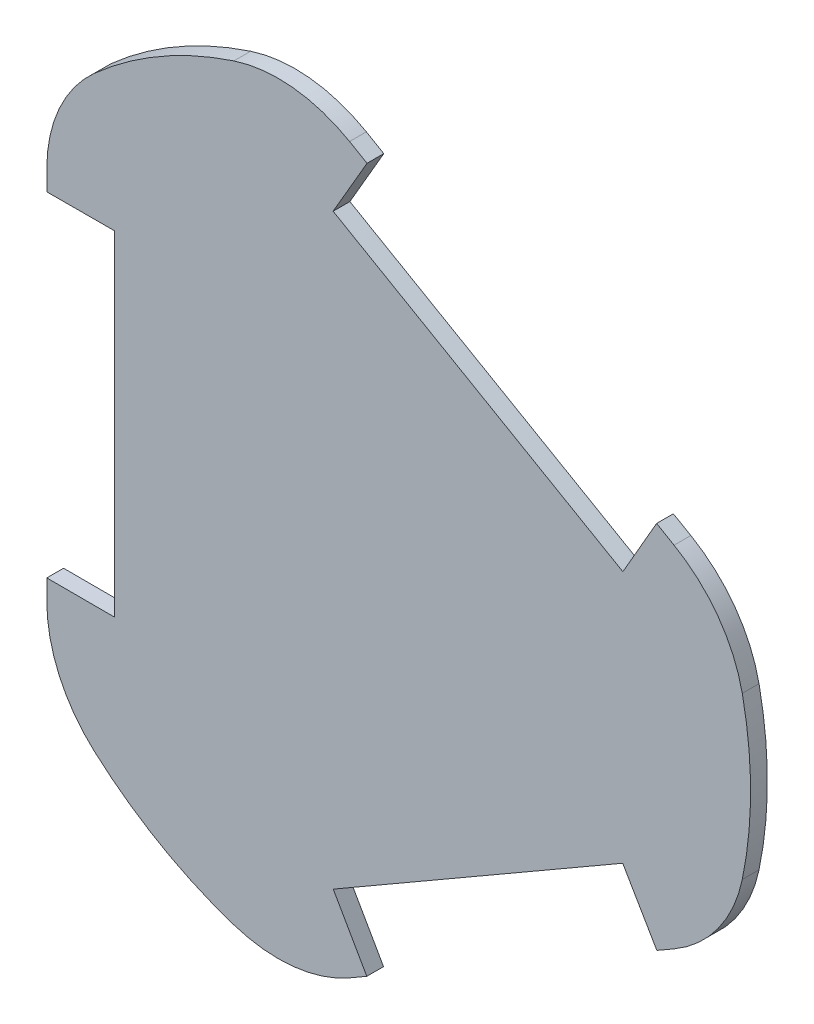
ISO-10303-21;
HEADER;
FILE_DESCRIPTION(('STEP AP214'),'2;1');
FILE_NAME('part.step','',(''),(''),'','','');
FILE_SCHEMA(('AUTOMOTIVE_DESIGN { 1 0 10303 214 1 1 1 1 }'));
ENDSEC;
DATA;
#1=APPLICATION_CONTEXT('core data for automotive mechanical design processes');
#2=APPLICATION_PROTOCOL_DEFINITION('international standard','automotive_design',2000,#1);
#3=PRODUCT_CONTEXT('',#1,'mechanical');
#4=PRODUCT('Part','Part','',(#3));
#5=PRODUCT_RELATED_PRODUCT_CATEGORY('part','',(#4));
#6=PRODUCT_DEFINITION_FORMATION('','',#4);
#7=PRODUCT_DEFINITION_CONTEXT('part definition',#1,'design');
#8=PRODUCT_DEFINITION('design','',#6,#7);
#9=PRODUCT_DEFINITION_SHAPE('','',#8);
#10=(LENGTH_UNIT() NAMED_UNIT(*) SI_UNIT(.MILLI.,.METRE.));
#11=(NAMED_UNIT(*) PLANE_ANGLE_UNIT() SI_UNIT($,.RADIAN.));
#12=(NAMED_UNIT(*) SI_UNIT($,.STERADIAN.) SOLID_ANGLE_UNIT());
#13=UNCERTAINTY_MEASURE_WITH_UNIT(LENGTH_MEASURE(1.E-05),#10,'distance_accuracy_value','');
#14=(GEOMETRIC_REPRESENTATION_CONTEXT(3) GLOBAL_UNCERTAINTY_ASSIGNED_CONTEXT((#13)) GLOBAL_UNIT_ASSIGNED_CONTEXT((#10,
#11,#12)) REPRESENTATION_CONTEXT('',''));
#15=CARTESIAN_POINT('',(0.,0.,0.));
#16=DIRECTION('',(0.,0.,1.));
#17=DIRECTION('',(1.,0.,0.));
#18=AXIS2_PLACEMENT_3D('',#15,#16,#17);
#19=CARTESIAN_POINT('',(24.3649167310369,6.14016818818991,0.));
#20=DIRECTION('',(0.,0.,1.));
#21=DIRECTION('',(1.,0.,0.));
#22=AXIS2_PLACEMENT_3D('',#19,#20,#21);
#23=PLANE('',#22);
#24=CARTESIAN_POINT('',(34.9999999999922,3.2533004068469E-11,0.));
#25=DIRECTION('',(0.,0.,1.));
#26=DIRECTION('',(1.,0.,0.));
#27=AXIS2_PLACEMENT_3D('',#24,#25,#26);
#28=CIRCLE('',#27,4.);
#29=CARTESIAN_POINT('',(38.9999999999922,3.2533004068469E-11,0.));
#30=VERTEX_POINT('',#29);
#31=EDGE_CURVE('E45',#30,#30,#28,.F.);
#32=ORIENTED_EDGE('',*,*,#31,.F.);
#33=EDGE_LOOP('',(#32));
#34=FACE_BOUND('',#33,.T.);
#35=DIRECTION('',(-0.498246690740071,-0.867035313679073,0.));
#36=VECTOR('',#35,1.);
#37=CARTESIAN_POINT('',(26.7547595720983,15.0665843364429,0.));
#38=LINE('',#37,#36);
#39=CARTESIAN_POINT('',(30.7778982947794,22.0675407085023,0.));
#40=VERTEX_POINT('',#39);
#41=CARTESIAN_POINT('',(26.7547595720983,15.0665843364429,0.));
#42=VERTEX_POINT('',#41);
#43=EDGE_CURVE('E230',#40,#42,#38,.T.);
#44=ORIENTED_EDGE('',*,*,#43,.F.);
#45=DIRECTION('',(-0.866025403784439,0.499999999999999,0.));
#46=VECTOR('',#45,1.);
#47=CARTESIAN_POINT('',(32.8649167310369,20.8626000525253,0.));
#48=LINE('',#47,#46);
#49=CARTESIAN_POINT('',(32.8649167310369,20.8626000525254,0.));
#50=VERTEX_POINT('',#49);
#51=EDGE_CURVE('E135',#50,#40,#48,.T.);
#52=ORIENTED_EDGE('',*,*,#51,.F.);
#53=CARTESIAN_POINT('',(24.3649167310369,6.14016818818991,0.));
#54=DIRECTION('',(0.,0.,1.));
#55=DIRECTION('',(1.,0.,0.));
#56=AXIS2_PLACEMENT_3D('',#53,#54,#55);
#57=CIRCLE('',#56,17.);
#58=CARTESIAN_POINT('',(41.0050362119579,9.61959682816414,0.));
#59=VERTEX_POINT('',#58);
#60=EDGE_CURVE('E129',#59,#50,#57,.T.);
#61=ORIENTED_EDGE('',*,*,#60,.F.);
#62=CARTESIAN_POINT('',(-5.0000000000002,0.,0.));
#63=DIRECTION('',(0.,0.,1.));
#64=DIRECTION('',(1.,0.,0.));
#65=AXIS2_PLACEMENT_3D('',#62,#63,#64);
#66=CIRCLE('',#65,47.);
#67=CARTESIAN_POINT('',(41.0050362119577,-9.61959682816483,0.));
#68=VERTEX_POINT('',#67);
#69=EDGE_CURVE('E220',#68,#59,#66,.T.);
#70=ORIENTED_EDGE('',*,*,#69,.F.);
#71=CARTESIAN_POINT('',(24.3649167310368,-6.14016818819028,0.));
#72=DIRECTION('',(0.,0.,1.));
#73=DIRECTION('',(1.,0.,0.));
#74=AXIS2_PLACEMENT_3D('',#71,#72,#73);
#75=CIRCLE('',#74,17.);
#76=CARTESIAN_POINT('',(32.8649167310368,-20.8626000525257,0.));
#77=VERTEX_POINT('',#76);
#78=EDGE_CURVE('E277',#77,#68,#75,.T.);
#79=ORIENTED_EDGE('',*,*,#78,.F.);
#80=DIRECTION('',(0.866025403784442,0.499999999999995,0.));
#81=VECTOR('',#80,1.);
#82=CARTESIAN_POINT('',(30.8072038679496,-22.0506211279441,0.));
#83=LINE('',#82,#81);
#84=CARTESIAN_POINT('',(30.8072038679496,-22.0506211279441,0.));
#85=VERTEX_POINT('',#84);
#86=EDGE_CURVE('E274',#85,#77,#83,.T.);
#87=ORIENTED_EDGE('',*,*,#86,.F.);
#88=DIRECTION('',(0.504242856002417,-0.863561892495567,0.));
#89=VECTOR('',#88,1.);
#90=CARTESIAN_POINT('',(26.7356087610421,-15.0776430596542,0.));
#91=LINE('',#90,#89);
#92=CARTESIAN_POINT('',(26.7356087610421,-15.0776430596542,0.));
#93=VERTEX_POINT('',#92);
#94=EDGE_CURVE('E272',#93,#85,#91,.T.);
#95=ORIENTED_EDGE('',*,*,#94,.F.);
#96=DIRECTION('',(0.866025425453361,0.499999962468324,0.));
#97=VECTOR('',#96,1.);
#98=CARTESIAN_POINT('',(-7.811356047376,-35.0233404952242,0.));
#99=LINE('',#98,#97);
#100=CARTESIAN_POINT('',(-7.811356047376,-35.0233404952242,0.));
#101=VERTEX_POINT('',#100);
#102=EDGE_CURVE('E270',#101,#93,#99,.T.);
#103=ORIENTED_EDGE('',*,*,#102,.F.);
#104=DIRECTION('',(-0.495744684649194,0.868468311248068,0.));
#105=VECTOR('',#104,1.);
#106=CARTESIAN_POINT('',(-3.80838001060019,-42.0359377983809,0.));
#107=LINE('',#106,#105);
#108=CARTESIAN_POINT('',(-3.80838001060019,-42.0359377983809,0.));
#109=VERTEX_POINT('',#108);
#110=EDGE_CURVE('E268',#109,#101,#107,.T.);
#111=ORIENTED_EDGE('',*,*,#110,.F.);
#112=DIRECTION('',(0.86602540378444,0.499999999999997,0.));
#113=VECTOR('',#112,1.);
#114=CARTESIAN_POINT('',(-5.86491673103678,-43.2232798275233,0.));
#115=LINE('',#114,#113);
#116=CARTESIAN_POINT('',(-5.86491673103678,-43.2232798275233,0.));
#117=VERTEX_POINT('',#116);
#118=EDGE_CURVE('E266',#117,#109,#115,.T.);
#119=ORIENTED_EDGE('',*,*,#118,.F.);
#120=CARTESIAN_POINT('',(-14.3649167310368,-28.5008479631878,0.));
#121=DIRECTION('',(0.,0.,1.));
#122=DIRECTION('',(1.,0.,0.));
#123=AXIS2_PLACEMENT_3D('',#120,#121,#122);
#124=CIRCLE('',#123,17.);
#125=CARTESIAN_POINT('',(-19.6717028786242,-44.6513284756609,0.));
#126=VERTEX_POINT('',#125);
#127=EDGE_CURVE('E264',#126,#117,#124,.T.);
#128=ORIENTED_EDGE('',*,*,#127,.F.);
#129=CARTESIAN_POINT('',(-5.0000000000002,0.,0.));
#130=DIRECTION('',(0.,0.,1.));
#131=DIRECTION('',(1.,0.,0.));
#132=AXIS2_PLACEMENT_3D('',#129,#130,#131);
#133=CIRCLE('',#132,47.);
#134=CARTESIAN_POINT('',(-36.3333333333329,-35.0317316474972,0.));
#135=VERTEX_POINT('',#134);
#136=EDGE_CURVE('E261',#135,#126,#133,.T.);
#137=ORIENTED_EDGE('',*,*,#136,.F.);
#138=CARTESIAN_POINT('',(-24.9999999999998,-22.3606797749982,0.));
#139=DIRECTION('',(0.,0.,1.));
#140=DIRECTION('',(1.,0.,0.));
#141=AXIS2_PLACEMENT_3D('',#138,#139,#140);
#142=CIRCLE('',#141,17.);
#143=CARTESIAN_POINT('',(-41.9999999999998,-22.3606797749982,0.));
#144=VERTEX_POINT('',#143);
#145=EDGE_CURVE('E259',#144,#135,#142,.T.);
#146=ORIENTED_EDGE('',*,*,#145,.F.);
#147=DIRECTION('',(0.,-1.,0.));
#148=VECTOR('',#147,1.);
#149=CARTESIAN_POINT('',(-41.9999999999998,-19.9494445745012,0.));
#150=LINE('',#149,#148);
#151=CARTESIAN_POINT('',(-41.9999999999998,-19.9494445745012,0.));
#152=VERTEX_POINT('',#151);
#153=EDGE_CURVE('E256',#152,#144,#150,.T.);
#154=ORIENTED_EDGE('',*,*,#153,.F.);
#155=DIRECTION('',(-0.999997953676558,0.00202302810078846,0.));
#156=VECTOR('',#155,1.);
#157=CARTESIAN_POINT('',(-33.9254246999456,-19.9657797006621,0.));
#158=LINE('',#157,#156);
#159=CARTESIAN_POINT('',(-33.9254246999456,-19.9657797006621,0.));
#160=VERTEX_POINT('',#159);
#161=EDGE_CURVE('E254',#160,#152,#158,.T.);
#162=ORIENTED_EDGE('',*,*,#161,.F.);
#163=DIRECTION('',(0.,-1.,0.));
#164=VECTOR('',#163,1.);
#165=CARTESIAN_POINT('',(-33.9254246999456,19.967136312018,0.));
#166=LINE('',#165,#164);
#167=CARTESIAN_POINT('',(-33.9254246999456,19.967136312018,0.));
#168=VERTEX_POINT('',#167);
#169=EDGE_CURVE('E252',#168,#160,#166,.T.);
#170=ORIENTED_EDGE('',*,*,#169,.F.);
#171=DIRECTION('',(0.999997952994323,0.0020233653066744,0.));
#172=VECTOR('',#171,1.);
#173=CARTESIAN_POINT('',(-41.9999999999998,19.950798463046,0.));
#174=LINE('',#173,#172);
#175=CARTESIAN_POINT('',(-41.9999999999998,19.950798463046,0.));
#176=VERTEX_POINT('',#175);
#177=EDGE_CURVE('E250',#176,#168,#174,.T.);
#178=ORIENTED_EDGE('',*,*,#177,.F.);
#179=DIRECTION('',(0.,-1.,0.));
#180=VECTOR('',#179,1.);
#181=CARTESIAN_POINT('',(-41.9999999999998,22.3606797749984,0.));
#182=LINE('',#181,#180);
#183=CARTESIAN_POINT('',(-41.9999999999998,22.3606797749984,0.));
#184=VERTEX_POINT('',#183);
#185=EDGE_CURVE('E248',#184,#176,#182,.T.);
#186=ORIENTED_EDGE('',*,*,#185,.F.);
#187=CARTESIAN_POINT('',(-24.9999999999998,22.3606797749984,0.));
#188=DIRECTION('',(0.,0.,1.));
#189=DIRECTION('',(1.,0.,0.));
#190=AXIS2_PLACEMENT_3D('',#187,#188,#189);
#191=CIRCLE('',#190,17.);
#192=CARTESIAN_POINT('',(-36.3333333333329,35.0317316474974,0.));
#193=VERTEX_POINT('',#192);
#194=EDGE_CURVE('E246',#193,#184,#191,.T.);
#195=ORIENTED_EDGE('',*,*,#194,.F.);
#196=CARTESIAN_POINT('',(-5.0000000000002,0.,0.));
#197=DIRECTION('',(0.,0.,1.));
#198=DIRECTION('',(1.,0.,0.));
#199=AXIS2_PLACEMENT_3D('',#196,#197,#198);
#200=CIRCLE('',#199,47.);
#201=CARTESIAN_POINT('',(-19.671702878625,44.6513284756608,0.));
#202=VERTEX_POINT('',#201);
#203=EDGE_CURVE('E243',#202,#193,#200,.T.);
#204=ORIENTED_EDGE('',*,*,#203,.F.);
#205=CARTESIAN_POINT('',(-14.3649167310373,28.5008479631878,0.));
#206=DIRECTION('',(0.,0.,1.));
#207=DIRECTION('',(1.,0.,0.));
#208=AXIS2_PLACEMENT_3D('',#205,#206,#207);
#209=CIRCLE('',#208,17.);
#210=CARTESIAN_POINT('',(-5.86491673103731,43.2232798275233,0.));
#211=VERTEX_POINT('',#210);
#212=EDGE_CURVE('E241',#211,#202,#209,.T.);
#213=ORIENTED_EDGE('',*,*,#212,.F.);
#214=DIRECTION('',(-0.866025403784435,0.500000000000007,0.));
#215=VECTOR('',#214,1.);
#216=CARTESIAN_POINT('',(-3.77672579290781,42.0176622272748,0.));
#217=LINE('',#216,#215);
#218=CARTESIAN_POINT('',(-3.77672579290781,42.0176622272748,0.));
#219=VERTEX_POINT('',#218);
#220=EDGE_CURVE('E238',#219,#211,#217,.T.);
#221=ORIENTED_EDGE('',*,*,#220,.F.);
#222=DIRECTION('',(0.501750970566136,0.865012117565957,0.));
#223=VECTOR('',#222,1.);
#224=CARTESIAN_POINT('',(-7.82815927419549,35.0330438400458,0.));
#225=LINE('',#224,#223);
#226=CARTESIAN_POINT('',(-7.82815927419549,35.0330438400458,0.));
#227=VERTEX_POINT('',#226);
#228=EDGE_CURVE('E236',#227,#219,#225,.T.);
#229=ORIENTED_EDGE('',*,*,#228,.F.);
#230=DIRECTION('',(-0.866025382115517,0.500000037531672,0.));
#231=VECTOR('',#230,1.);
#232=CARTESIAN_POINT('',(26.7547595720983,15.0665843364429,0.));
#233=LINE('',#232,#231);
#234=EDGE_CURVE('E233',#42,#227,#233,.T.);
#235=ORIENTED_EDGE('',*,*,#234,.F.);
#236=EDGE_LOOP('',(#44,#52,#61,#70,#79,#87,#95,#103,#111,#119,#128,#137,#146,#154,#162,#170,
#178,#186,#195,#204,#213,#221,#229,#235));
#237=FACE_BOUND('',#236,.T.);
#238=CARTESIAN_POINT('',(-25.0000000000225,34.6410161513548,0.));
#239=DIRECTION('',(0.,0.,1.));
#240=DIRECTION('',(1.,0.,0.));
#241=AXIS2_PLACEMENT_3D('',#238,#239,#240);
#242=CIRCLE('',#241,4.);
#243=CARTESIAN_POINT('',(-21.0000000000225,34.6410161513548,0.));
#244=VERTEX_POINT('',#243);
#245=EDGE_CURVE('E345',#244,#244,#242,.F.);
#246=ORIENTED_EDGE('',*,*,#245,.F.);
#247=EDGE_LOOP('',(#246));
#248=FACE_BOUND('',#247,.T.);
#249=CARTESIAN_POINT('',(-24.9999999999673,-34.6410161513854,0.));
#250=DIRECTION('',(0.,0.,1.));
#251=DIRECTION('',(1.,0.,0.));
#252=AXIS2_PLACEMENT_3D('',#249,#250,#251);
#253=CIRCLE('',#252,4.);
#254=CARTESIAN_POINT('',(-20.9999999999673,-34.6410161513854,0.));
#255=VERTEX_POINT('',#254);
#256=EDGE_CURVE('E11',#255,#255,#253,.F.);
#257=ORIENTED_EDGE('',*,*,#256,.F.);
#258=EDGE_LOOP('',(#257));
#259=FACE_BOUND('',#258,.T.);
#260=ADVANCED_FACE('F36',(#34,#237,#248,#259),#23,.F.);
#261=CARTESIAN_POINT('',(24.3649167310369,6.14016818818991,2.));
#262=DIRECTION('',(0.,0.,1.));
#263=DIRECTION('',(1.,0.,0.));
#264=AXIS2_PLACEMENT_3D('',#261,#262,#263);
#265=PLANE('',#264);
#266=DIRECTION('',(-0.498246690740071,-0.867035313679073,0.));
#267=VECTOR('',#266,1.);
#268=CARTESIAN_POINT('',(26.7547595720983,15.0665843364429,2.));
#269=LINE('',#268,#267);
#270=CARTESIAN_POINT('',(30.7778982947794,22.0675407085023,2.));
#271=VERTEX_POINT('',#270);
#272=CARTESIAN_POINT('',(26.7547595720983,15.0665843364429,2.));
#273=VERTEX_POINT('',#272);
#274=EDGE_CURVE('E282',#271,#273,#269,.T.);
#275=ORIENTED_EDGE('',*,*,#274,.T.);
#276=DIRECTION('',(-0.866025382115517,0.500000037531672,0.));
#277=VECTOR('',#276,1.);
#278=CARTESIAN_POINT('',(26.7547595720983,15.0665843364429,2.));
#279=LINE('',#278,#277);
#280=CARTESIAN_POINT('',(-7.82815927419549,35.0330438400458,2.));
#281=VERTEX_POINT('',#280);
#282=EDGE_CURVE('E144',#273,#281,#279,.T.);
#283=ORIENTED_EDGE('',*,*,#282,.T.);
#284=DIRECTION('',(0.501750970566136,0.865012117565957,0.));
#285=VECTOR('',#284,1.);
#286=CARTESIAN_POINT('',(-7.82815927419549,35.0330438400458,2.));
#287=LINE('',#286,#285);
#288=CARTESIAN_POINT('',(-3.77672579290781,42.0176622272748,2.));
#289=VERTEX_POINT('',#288);
#290=EDGE_CURVE('E482',#281,#289,#287,.T.);
#291=ORIENTED_EDGE('',*,*,#290,.T.);
#292=DIRECTION('',(-0.866025403784435,0.500000000000007,0.));
#293=VECTOR('',#292,1.);
#294=CARTESIAN_POINT('',(-3.77672579290781,42.0176622272748,2.));
#295=LINE('',#294,#293);
#296=CARTESIAN_POINT('',(-5.86491673103731,43.2232798275233,2.));
#297=VERTEX_POINT('',#296);
#298=EDGE_CURVE('E492',#289,#297,#295,.T.);
#299=ORIENTED_EDGE('',*,*,#298,.T.);
#300=CARTESIAN_POINT('',(-14.3649167310373,28.5008479631878,2.));
#301=DIRECTION('',(0.,0.,1.));
#302=DIRECTION('',(1.,0.,0.));
#303=AXIS2_PLACEMENT_3D('',#300,#301,#302);
#304=CIRCLE('',#303,17.);
#305=CARTESIAN_POINT('',(-19.671702878625,44.6513284756608,2.));
#306=VERTEX_POINT('',#305);
#307=EDGE_CURVE('E489',#297,#306,#304,.T.);
#308=ORIENTED_EDGE('',*,*,#307,.T.);
#309=CARTESIAN_POINT('',(-5.0000000000002,0.,2.));
#310=DIRECTION('',(0.,0.,1.));
#311=DIRECTION('',(1.,0.,0.));
#312=AXIS2_PLACEMENT_3D('',#309,#310,#311);
#313=CIRCLE('',#312,47.);
#314=CARTESIAN_POINT('',(-36.3333333333329,35.0317316474974,2.));
#315=VERTEX_POINT('',#314);
#316=EDGE_CURVE('E491',#306,#315,#313,.T.);
#317=ORIENTED_EDGE('',*,*,#316,.T.);
#318=CARTESIAN_POINT('',(-24.9999999999998,22.3606797749984,2.));
#319=DIRECTION('',(0.,0.,1.));
#320=DIRECTION('',(1.,0.,0.));
#321=AXIS2_PLACEMENT_3D('',#318,#319,#320);
#322=CIRCLE('',#321,17.);
#323=CARTESIAN_POINT('',(-41.9999999999998,22.3606797749984,2.));
#324=VERTEX_POINT('',#323);
#325=EDGE_CURVE('E494',#315,#324,#322,.T.);
#326=ORIENTED_EDGE('',*,*,#325,.T.);
#327=DIRECTION('',(0.,-1.,0.));
#328=VECTOR('',#327,1.);
#329=CARTESIAN_POINT('',(-41.9999999999998,22.3606797749984,2.));
#330=LINE('',#329,#328);
#331=CARTESIAN_POINT('',(-41.9999999999998,19.950798463046,2.));
#332=VERTEX_POINT('',#331);
#333=EDGE_CURVE('E500',#324,#332,#330,.T.);
#334=ORIENTED_EDGE('',*,*,#333,.T.);
#335=DIRECTION('',(0.999997952994323,0.0020233653066744,0.));
#336=VECTOR('',#335,1.);
#337=CARTESIAN_POINT('',(-41.9999999999998,19.950798463046,2.));
#338=LINE('',#337,#336);
#339=CARTESIAN_POINT('',(-33.9254246999456,19.967136312018,2.));
#340=VERTEX_POINT('',#339);
#341=EDGE_CURVE('E502',#332,#340,#338,.T.);
#342=ORIENTED_EDGE('',*,*,#341,.T.);
#343=DIRECTION('',(0.,-1.,0.));
#344=VECTOR('',#343,1.);
#345=CARTESIAN_POINT('',(-33.9254246999456,19.967136312018,2.));
#346=LINE('',#345,#344);
#347=CARTESIAN_POINT('',(-33.9254246999456,-19.9657797006621,2.));
#348=VERTEX_POINT('',#347);
#349=EDGE_CURVE('E504',#340,#348,#346,.T.);
#350=ORIENTED_EDGE('',*,*,#349,.T.);
#351=DIRECTION('',(-0.999997953676558,0.00202302810078846,0.));
#352=VECTOR('',#351,1.);
#353=CARTESIAN_POINT('',(-33.9254246999456,-19.9657797006621,2.));
#354=LINE('',#353,#352);
#355=CARTESIAN_POINT('',(-41.9999999999998,-19.9494445745012,2.));
#356=VERTEX_POINT('',#355);
#357=EDGE_CURVE('E506',#348,#356,#354,.T.);
#358=ORIENTED_EDGE('',*,*,#357,.T.);
#359=DIRECTION('',(0.,-1.,0.));
#360=VECTOR('',#359,1.);
#361=CARTESIAN_POINT('',(-41.9999999999998,-19.9494445745012,2.));
#362=LINE('',#361,#360);
#363=CARTESIAN_POINT('',(-41.9999999999998,-22.3606797749982,2.));
#364=VERTEX_POINT('',#363);
#365=EDGE_CURVE('E508',#356,#364,#362,.T.);
#366=ORIENTED_EDGE('',*,*,#365,.T.);
#367=CARTESIAN_POINT('',(-24.9999999999998,-22.3606797749982,2.));
#368=DIRECTION('',(0.,0.,1.));
#369=DIRECTION('',(1.,0.,0.));
#370=AXIS2_PLACEMENT_3D('',#367,#368,#369);
#371=CIRCLE('',#370,17.);
#372=CARTESIAN_POINT('',(-36.3333333333329,-35.0317316474972,2.));
#373=VERTEX_POINT('',#372);
#374=EDGE_CURVE('E510',#364,#373,#371,.T.);
#375=ORIENTED_EDGE('',*,*,#374,.T.);
#376=CARTESIAN_POINT('',(-5.0000000000002,0.,2.));
#377=DIRECTION('',(0.,0.,1.));
#378=DIRECTION('',(1.,0.,0.));
#379=AXIS2_PLACEMENT_3D('',#376,#377,#378);
#380=CIRCLE('',#379,47.);
#381=CARTESIAN_POINT('',(-19.6717028786242,-44.6513284756609,2.));
#382=VERTEX_POINT('',#381);
#383=EDGE_CURVE('E512',#373,#382,#380,.T.);
#384=ORIENTED_EDGE('',*,*,#383,.T.);
#385=CARTESIAN_POINT('',(-14.3649167310368,-28.5008479631878,2.));
#386=DIRECTION('',(0.,0.,1.));
#387=DIRECTION('',(1.,0.,0.));
#388=AXIS2_PLACEMENT_3D('',#385,#386,#387);
#389=CIRCLE('',#388,17.);
#390=CARTESIAN_POINT('',(-5.86491673103678,-43.2232798275233,2.));
#391=VERTEX_POINT('',#390);
#392=EDGE_CURVE('E514',#382,#391,#389,.T.);
#393=ORIENTED_EDGE('',*,*,#392,.T.);
#394=DIRECTION('',(0.86602540378444,0.499999999999997,0.));
#395=VECTOR('',#394,1.);
#396=CARTESIAN_POINT('',(-5.86491673103678,-43.2232798275233,2.));
#397=LINE('',#396,#395);
#398=CARTESIAN_POINT('',(-3.80838001060019,-42.0359377983809,2.));
#399=VERTEX_POINT('',#398);
#400=EDGE_CURVE('E516',#391,#399,#397,.T.);
#401=ORIENTED_EDGE('',*,*,#400,.T.);
#402=DIRECTION('',(-0.495744684649194,0.868468311248068,0.));
#403=VECTOR('',#402,1.);
#404=CARTESIAN_POINT('',(-3.80838001060019,-42.0359377983809,2.));
#405=LINE('',#404,#403);
#406=CARTESIAN_POINT('',(-7.811356047376,-35.0233404952242,2.));
#407=VERTEX_POINT('',#406);
#408=EDGE_CURVE('E518',#399,#407,#405,.T.);
#409=ORIENTED_EDGE('',*,*,#408,.T.);
#410=DIRECTION('',(0.866025425453361,0.499999962468324,0.));
#411=VECTOR('',#410,1.);
#412=CARTESIAN_POINT('',(-7.811356047376,-35.0233404952242,2.));
#413=LINE('',#412,#411);
#414=CARTESIAN_POINT('',(26.7356087610421,-15.0776430596542,2.));
#415=VERTEX_POINT('',#414);
#416=EDGE_CURVE('E520',#407,#415,#413,.T.);
#417=ORIENTED_EDGE('',*,*,#416,.T.);
#418=DIRECTION('',(0.504242856002417,-0.863561892495567,0.));
#419=VECTOR('',#418,1.);
#420=CARTESIAN_POINT('',(26.7356087610421,-15.0776430596542,2.));
#421=LINE('',#420,#419);
#422=CARTESIAN_POINT('',(30.8072038679496,-22.0506211279441,2.));
#423=VERTEX_POINT('',#422);
#424=EDGE_CURVE('E522',#415,#423,#421,.T.);
#425=ORIENTED_EDGE('',*,*,#424,.T.);
#426=DIRECTION('',(0.866025403784442,0.499999999999995,0.));
#427=VECTOR('',#426,1.);
#428=CARTESIAN_POINT('',(30.8072038679496,-22.0506211279441,2.));
#429=LINE('',#428,#427);
#430=CARTESIAN_POINT('',(32.8649167310368,-20.8626000525257,2.));
#431=VERTEX_POINT('',#430);
#432=EDGE_CURVE('E524',#423,#431,#429,.T.);
#433=ORIENTED_EDGE('',*,*,#432,.T.);
#434=CARTESIAN_POINT('',(24.3649167310368,-6.14016818819028,2.));
#435=DIRECTION('',(0.,0.,1.));
#436=DIRECTION('',(1.,0.,0.));
#437=AXIS2_PLACEMENT_3D('',#434,#435,#436);
#438=CIRCLE('',#437,17.);
#439=CARTESIAN_POINT('',(41.0050362119577,-9.61959682816483,2.));
#440=VERTEX_POINT('',#439);
#441=EDGE_CURVE('E211',#431,#440,#438,.T.);
#442=ORIENTED_EDGE('',*,*,#441,.T.);
#443=CARTESIAN_POINT('',(-5.0000000000002,0.,2.));
#444=DIRECTION('',(0.,0.,1.));
#445=DIRECTION('',(1.,0.,0.));
#446=AXIS2_PLACEMENT_3D('',#443,#444,#445);
#447=CIRCLE('',#446,47.);
#448=CARTESIAN_POINT('',(41.0050362119579,9.61959682816414,2.));
#449=VERTEX_POINT('',#448);
#450=EDGE_CURVE('E205',#440,#449,#447,.T.);
#451=ORIENTED_EDGE('',*,*,#450,.T.);
#452=CARTESIAN_POINT('',(24.3649167310369,6.14016818818991,2.));
#453=DIRECTION('',(0.,0.,1.));
#454=DIRECTION('',(1.,0.,0.));
#455=AXIS2_PLACEMENT_3D('',#452,#453,#454);
#456=CIRCLE('',#455,17.);
#457=CARTESIAN_POINT('',(32.8649167310369,20.8626000525254,2.));
#458=VERTEX_POINT('',#457);
#459=EDGE_CURVE('E209',#449,#458,#456,.T.);
#460=ORIENTED_EDGE('',*,*,#459,.T.);
#461=DIRECTION('',(-0.866025403784439,0.499999999999999,0.));
#462=VECTOR('',#461,1.);
#463=CARTESIAN_POINT('',(32.8649167310369,20.8626000525253,2.));
#464=LINE('',#463,#462);
#465=EDGE_CURVE('E53',#458,#271,#464,.T.);
#466=ORIENTED_EDGE('',*,*,#465,.T.);
#467=EDGE_LOOP('',(#275,#283,#291,#299,#308,#317,#326,#334,#342,#350,#358,#366,#375,#384,#393,
#401,#409,#417,#425,#433,#442,#451,#460,#466));
#468=FACE_BOUND('',#467,.T.);
#469=ADVANCED_FACE('F207',(#468),#265,.T.);
#470=CARTESIAN_POINT('',(26.7547595720983,15.0665843364429,2.));
#471=DIRECTION('',(0.867035313679073,-0.498246690740071,0.));
#472=DIRECTION('',(0.498246690740071,0.867035313679073,0.));
#473=AXIS2_PLACEMENT_3D('',#470,#471,#472);
#474=PLANE('',#473);
#475=ORIENTED_EDGE('',*,*,#43,.T.);
#476=DIRECTION('',(0.,0.,-1.));
#477=VECTOR('',#476,1.);
#478=CARTESIAN_POINT('',(26.7547595720983,15.0665843364429,2.));
#479=LINE('',#478,#477);
#480=EDGE_CURVE('E343',#273,#42,#479,.T.);
#481=ORIENTED_EDGE('',*,*,#480,.F.);
#482=ORIENTED_EDGE('',*,*,#274,.F.);
#483=DIRECTION('',(0.,0.,-1.));
#484=VECTOR('',#483,1.);
#485=CARTESIAN_POINT('',(30.7778982947794,22.0675407085023,2.));
#486=LINE('',#485,#484);
#487=EDGE_CURVE('E226',#271,#40,#486,.T.);
#488=ORIENTED_EDGE('',*,*,#487,.T.);
#489=EDGE_LOOP('',(#475,#481,#482,#488));
#490=FACE_BOUND('',#489,.T.);
#491=ADVANCED_FACE('F38',(#490),#474,.F.);
#492=CARTESIAN_POINT('',(26.7547595720983,15.0665843364429,2.));
#493=DIRECTION('',(-0.500000037531672,-0.866025382115517,0.));
#494=DIRECTION('',(0.866025382115517,-0.500000037531672,0.));
#495=AXIS2_PLACEMENT_3D('',#492,#493,#494);
#496=PLANE('',#495);
#497=ORIENTED_EDGE('',*,*,#234,.T.);
#498=DIRECTION('',(0.,0.,-1.));
#499=VECTOR('',#498,1.);
#500=CARTESIAN_POINT('',(-7.82815927419549,35.0330438400458,2.));
#501=LINE('',#500,#499);
#502=EDGE_CURVE('E340',#281,#227,#501,.T.);
#503=ORIENTED_EDGE('',*,*,#502,.F.);
#504=ORIENTED_EDGE('',*,*,#282,.F.);
#505=ORIENTED_EDGE('',*,*,#480,.T.);
#506=EDGE_LOOP('',(#497,#503,#504,#505));
#507=FACE_BOUND('',#506,.T.);
#508=ADVANCED_FACE('F471',(#507),#496,.F.);
#509=CARTESIAN_POINT('',(-7.82815927419549,35.0330438400458,2.));
#510=DIRECTION('',(-0.865012117565957,0.501750970566136,0.));
#511=DIRECTION('',(-0.501750970566136,-0.865012117565957,0.));
#512=AXIS2_PLACEMENT_3D('',#509,#510,#511);
#513=PLANE('',#512);
#514=ORIENTED_EDGE('',*,*,#228,.T.);
#515=DIRECTION('',(0.,0.,-1.));
#516=VECTOR('',#515,1.);
#517=CARTESIAN_POINT('',(-3.77672579290781,42.0176622272748,2.));
#518=LINE('',#517,#516);
#519=EDGE_CURVE('E337',#289,#219,#518,.T.);
#520=ORIENTED_EDGE('',*,*,#519,.F.);
#521=ORIENTED_EDGE('',*,*,#290,.F.);
#522=ORIENTED_EDGE('',*,*,#502,.T.);
#523=EDGE_LOOP('',(#514,#520,#521,#522));
#524=FACE_BOUND('',#523,.T.);
#525=ADVANCED_FACE('F468',(#524),#513,.F.);
#526=CARTESIAN_POINT('',(-3.77672579290781,42.0176622272748,2.));
#527=DIRECTION('',(-0.500000000000007,-0.866025403784435,0.));
#528=DIRECTION('',(0.866025403784435,-0.500000000000007,0.));
#529=AXIS2_PLACEMENT_3D('',#526,#527,#528);
#530=PLANE('',#529);
#531=ORIENTED_EDGE('',*,*,#220,.T.);
#532=DIRECTION('',(0.,0.,-1.));
#533=VECTOR('',#532,1.);
#534=CARTESIAN_POINT('',(-5.86491673103731,43.2232798275233,2.));
#535=LINE('',#534,#533);
#536=EDGE_CURVE('E334',#297,#211,#535,.T.);
#537=ORIENTED_EDGE('',*,*,#536,.F.);
#538=ORIENTED_EDGE('',*,*,#298,.F.);
#539=ORIENTED_EDGE('',*,*,#519,.T.);
#540=EDGE_LOOP('',(#531,#537,#538,#539));
#541=FACE_BOUND('',#540,.T.);
#542=ADVANCED_FACE('F464',(#541),#530,.F.);
#543=CARTESIAN_POINT('',(-14.3649167310373,28.5008479631878,2.));
#544=DIRECTION('',(0.,0.,-1.));
#545=DIRECTION('',(-1.,0.,0.));
#546=AXIS2_PLACEMENT_3D('',#543,#544,#545);
#547=CYLINDRICAL_SURFACE('',#546,17.);
#548=ORIENTED_EDGE('',*,*,#212,.T.);
#549=DIRECTION('',(0.,0.,-1.));
#550=VECTOR('',#549,1.);
#551=CARTESIAN_POINT('',(-19.671702878625,44.6513284756608,2.));
#552=LINE('',#551,#550);
#553=EDGE_CURVE('E331',#306,#202,#552,.T.);
#554=ORIENTED_EDGE('',*,*,#553,.F.);
#555=ORIENTED_EDGE('',*,*,#307,.F.);
#556=ORIENTED_EDGE('',*,*,#536,.T.);
#557=EDGE_LOOP('',(#548,#554,#555,#556));
#558=FACE_BOUND('',#557,.T.);
#559=ADVANCED_FACE('F460',(#558),#547,.T.);
#560=CARTESIAN_POINT('',(-5.0000000000002,0.,2.));
#561=DIRECTION('',(0.,0.,-1.));
#562=DIRECTION('',(-1.,0.,0.));
#563=AXIS2_PLACEMENT_3D('',#560,#561,#562);
#564=CYLINDRICAL_SURFACE('',#563,47.);
#565=ORIENTED_EDGE('',*,*,#203,.T.);
#566=DIRECTION('',(0.,0.,-1.));
#567=VECTOR('',#566,1.);
#568=CARTESIAN_POINT('',(-36.3333333333329,35.0317316474974,2.));
#569=LINE('',#568,#567);
#570=EDGE_CURVE('E328',#315,#193,#569,.T.);
#571=ORIENTED_EDGE('',*,*,#570,.F.);
#572=ORIENTED_EDGE('',*,*,#316,.F.);
#573=ORIENTED_EDGE('',*,*,#553,.T.);
#574=EDGE_LOOP('',(#565,#571,#572,#573));
#575=FACE_BOUND('',#574,.T.);
#576=ADVANCED_FACE('F456',(#575),#564,.T.);
#577=CARTESIAN_POINT('',(-24.9999999999998,22.3606797749984,2.));
#578=DIRECTION('',(0.,0.,-1.));
#579=DIRECTION('',(-1.,0.,0.));
#580=AXIS2_PLACEMENT_3D('',#577,#578,#579);
#581=CYLINDRICAL_SURFACE('',#580,17.);
#582=ORIENTED_EDGE('',*,*,#194,.T.);
#583=DIRECTION('',(0.,0.,-1.));
#584=VECTOR('',#583,1.);
#585=CARTESIAN_POINT('',(-41.9999999999998,22.3606797749984,2.));
#586=LINE('',#585,#584);
#587=EDGE_CURVE('E325',#324,#184,#586,.T.);
#588=ORIENTED_EDGE('',*,*,#587,.F.);
#589=ORIENTED_EDGE('',*,*,#325,.F.);
#590=ORIENTED_EDGE('',*,*,#570,.T.);
#591=EDGE_LOOP('',(#582,#588,#589,#590));
#592=FACE_BOUND('',#591,.T.);
#593=ADVANCED_FACE('F452',(#592),#581,.T.);
#594=CARTESIAN_POINT('',(-41.9999999999998,22.3606797749984,2.));
#595=DIRECTION('',(1.,0.,0.));
#596=DIRECTION('',(0.,0.,-1.));
#597=AXIS2_PLACEMENT_3D('',#594,#595,#596);
#598=PLANE('',#597);
#599=ORIENTED_EDGE('',*,*,#185,.T.);
#600=DIRECTION('',(0.,0.,-1.));
#601=VECTOR('',#600,1.);
#602=CARTESIAN_POINT('',(-41.9999999999998,19.950798463046,2.));
#603=LINE('',#602,#601);
#604=EDGE_CURVE('E322',#332,#176,#603,.T.);
#605=ORIENTED_EDGE('',*,*,#604,.F.);
#606=ORIENTED_EDGE('',*,*,#333,.F.);
#607=ORIENTED_EDGE('',*,*,#587,.T.);
#608=EDGE_LOOP('',(#599,#605,#606,#607));
#609=FACE_BOUND('',#608,.T.);
#610=ADVANCED_FACE('F448',(#609),#598,.F.);
#611=CARTESIAN_POINT('',(-41.9999999999998,19.950798463046,2.));
#612=DIRECTION('',(-0.0020233653066744,0.999997952994323,0.));
#613=DIRECTION('',(-0.999997952994323,-0.0020233653066744,0.));
#614=AXIS2_PLACEMENT_3D('',#611,#612,#613);
#615=PLANE('',#614);
#616=ORIENTED_EDGE('',*,*,#177,.T.);
#617=DIRECTION('',(0.,0.,-1.));
#618=VECTOR('',#617,1.);
#619=CARTESIAN_POINT('',(-33.9254246999456,19.967136312018,2.));
#620=LINE('',#619,#618);
#621=EDGE_CURVE('E319',#340,#168,#620,.T.);
#622=ORIENTED_EDGE('',*,*,#621,.F.);
#623=ORIENTED_EDGE('',*,*,#341,.F.);
#624=ORIENTED_EDGE('',*,*,#604,.T.);
#625=EDGE_LOOP('',(#616,#622,#623,#624));
#626=FACE_BOUND('',#625,.T.);
#627=ADVANCED_FACE('F444',(#626),#615,.F.);
#628=CARTESIAN_POINT('',(-33.9254246999456,19.967136312018,2.));
#629=DIRECTION('',(1.,0.,0.));
#630=DIRECTION('',(0.,0.,-1.));
#631=AXIS2_PLACEMENT_3D('',#628,#629,#630);
#632=PLANE('',#631);
#633=ORIENTED_EDGE('',*,*,#169,.T.);
#634=DIRECTION('',(0.,0.,-1.));
#635=VECTOR('',#634,1.);
#636=CARTESIAN_POINT('',(-33.9254246999456,-19.9657797006621,2.));
#637=LINE('',#636,#635);
#638=EDGE_CURVE('E316',#348,#160,#637,.T.);
#639=ORIENTED_EDGE('',*,*,#638,.F.);
#640=ORIENTED_EDGE('',*,*,#349,.F.);
#641=ORIENTED_EDGE('',*,*,#621,.T.);
#642=EDGE_LOOP('',(#633,#639,#640,#641));
#643=FACE_BOUND('',#642,.T.);
#644=ADVANCED_FACE('F440',(#643),#632,.F.);
#645=CARTESIAN_POINT('',(-33.9254246999456,-19.9657797006621,2.));
#646=DIRECTION('',(-0.00202302810078846,-0.999997953676558,0.));
#647=DIRECTION('',(0.999997953676558,-0.00202302810078846,0.));
#648=AXIS2_PLACEMENT_3D('',#645,#646,#647);
#649=PLANE('',#648);
#650=ORIENTED_EDGE('',*,*,#161,.T.);
#651=DIRECTION('',(0.,0.,-1.));
#652=VECTOR('',#651,1.);
#653=CARTESIAN_POINT('',(-41.9999999999998,-19.9494445745012,2.));
#654=LINE('',#653,#652);
#655=EDGE_CURVE('E313',#356,#152,#654,.T.);
#656=ORIENTED_EDGE('',*,*,#655,.F.);
#657=ORIENTED_EDGE('',*,*,#357,.F.);
#658=ORIENTED_EDGE('',*,*,#638,.T.);
#659=EDGE_LOOP('',(#650,#656,#657,#658));
#660=FACE_BOUND('',#659,.T.);
#661=ADVANCED_FACE('F436',(#660),#649,.F.);
#662=CARTESIAN_POINT('',(-41.9999999999998,-19.9494445745012,2.));
#663=DIRECTION('',(1.,0.,0.));
#664=DIRECTION('',(0.,0.,-1.));
#665=AXIS2_PLACEMENT_3D('',#662,#663,#664);
#666=PLANE('',#665);
#667=ORIENTED_EDGE('',*,*,#153,.T.);
#668=DIRECTION('',(0.,0.,-1.));
#669=VECTOR('',#668,1.);
#670=CARTESIAN_POINT('',(-41.9999999999998,-22.3606797749982,2.));
#671=LINE('',#670,#669);
#672=EDGE_CURVE('E310',#364,#144,#671,.T.);
#673=ORIENTED_EDGE('',*,*,#672,.F.);
#674=ORIENTED_EDGE('',*,*,#365,.F.);
#675=ORIENTED_EDGE('',*,*,#655,.T.);
#676=EDGE_LOOP('',(#667,#673,#674,#675));
#677=FACE_BOUND('',#676,.T.);
#678=ADVANCED_FACE('F432',(#677),#666,.F.);
#679=CARTESIAN_POINT('',(-24.9999999999998,-22.3606797749982,2.));
#680=DIRECTION('',(0.,0.,-1.));
#681=DIRECTION('',(-1.,0.,0.));
#682=AXIS2_PLACEMENT_3D('',#679,#680,#681);
#683=CYLINDRICAL_SURFACE('',#682,17.);
#684=ORIENTED_EDGE('',*,*,#145,.T.);
#685=DIRECTION('',(0.,0.,-1.));
#686=VECTOR('',#685,1.);
#687=CARTESIAN_POINT('',(-36.3333333333329,-35.0317316474972,2.));
#688=LINE('',#687,#686);
#689=EDGE_CURVE('E307',#373,#135,#688,.T.);
#690=ORIENTED_EDGE('',*,*,#689,.F.);
#691=ORIENTED_EDGE('',*,*,#374,.F.);
#692=ORIENTED_EDGE('',*,*,#672,.T.);
#693=EDGE_LOOP('',(#684,#690,#691,#692));
#694=FACE_BOUND('',#693,.T.);
#695=ADVANCED_FACE('F428',(#694),#683,.T.);
#696=CARTESIAN_POINT('',(-5.0000000000002,0.,2.));
#697=DIRECTION('',(0.,0.,-1.));
#698=DIRECTION('',(-1.,0.,0.));
#699=AXIS2_PLACEMENT_3D('',#696,#697,#698);
#700=CYLINDRICAL_SURFACE('',#699,47.);
#701=ORIENTED_EDGE('',*,*,#136,.T.);
#702=DIRECTION('',(0.,0.,-1.));
#703=VECTOR('',#702,1.);
#704=CARTESIAN_POINT('',(-19.6717028786242,-44.6513284756609,2.));
#705=LINE('',#704,#703);
#706=EDGE_CURVE('E304',#382,#126,#705,.T.);
#707=ORIENTED_EDGE('',*,*,#706,.F.);
#708=ORIENTED_EDGE('',*,*,#383,.F.);
#709=ORIENTED_EDGE('',*,*,#689,.T.);
#710=EDGE_LOOP('',(#701,#707,#708,#709));
#711=FACE_BOUND('',#710,.T.);
#712=ADVANCED_FACE('F424',(#711),#700,.T.);
#713=CARTESIAN_POINT('',(-14.3649167310368,-28.5008479631878,2.));
#714=DIRECTION('',(0.,0.,-1.));
#715=DIRECTION('',(-1.,0.,0.));
#716=AXIS2_PLACEMENT_3D('',#713,#714,#715);
#717=CYLINDRICAL_SURFACE('',#716,17.);
#718=ORIENTED_EDGE('',*,*,#127,.T.);
#719=DIRECTION('',(0.,0.,-1.));
#720=VECTOR('',#719,1.);
#721=CARTESIAN_POINT('',(-5.86491673103678,-43.2232798275233,2.));
#722=LINE('',#721,#720);
#723=EDGE_CURVE('E301',#391,#117,#722,.T.);
#724=ORIENTED_EDGE('',*,*,#723,.F.);
#725=ORIENTED_EDGE('',*,*,#392,.F.);
#726=ORIENTED_EDGE('',*,*,#706,.T.);
#727=EDGE_LOOP('',(#718,#724,#725,#726));
#728=FACE_BOUND('',#727,.T.);
#729=ADVANCED_FACE('F420',(#728),#717,.T.);
#730=CARTESIAN_POINT('',(-5.86491673103678,-43.2232798275233,2.));
#731=DIRECTION('',(-0.499999999999997,0.86602540378444,0.));
#732=DIRECTION('',(-0.86602540378444,-0.499999999999997,0.));
#733=AXIS2_PLACEMENT_3D('',#730,#731,#732);
#734=PLANE('',#733);
#735=ORIENTED_EDGE('',*,*,#118,.T.);
#736=DIRECTION('',(0.,0.,-1.));
#737=VECTOR('',#736,1.);
#738=CARTESIAN_POINT('',(-3.80838001060019,-42.0359377983809,2.));
#739=LINE('',#738,#737);
#740=EDGE_CURVE('E298',#399,#109,#739,.T.);
#741=ORIENTED_EDGE('',*,*,#740,.F.);
#742=ORIENTED_EDGE('',*,*,#400,.F.);
#743=ORIENTED_EDGE('',*,*,#723,.T.);
#744=EDGE_LOOP('',(#735,#741,#742,#743));
#745=FACE_BOUND('',#744,.T.);
#746=ADVANCED_FACE('F416',(#745),#734,.F.);
#747=CARTESIAN_POINT('',(-3.80838001060019,-42.0359377983809,2.));
#748=DIRECTION('',(-0.868468311248068,-0.495744684649194,0.));
#749=DIRECTION('',(0.495744684649194,-0.868468311248068,0.));
#750=AXIS2_PLACEMENT_3D('',#747,#748,#749);
#751=PLANE('',#750);
#752=ORIENTED_EDGE('',*,*,#110,.T.);
#753=DIRECTION('',(0.,0.,-1.));
#754=VECTOR('',#753,1.);
#755=CARTESIAN_POINT('',(-7.811356047376,-35.0233404952242,2.));
#756=LINE('',#755,#754);
#757=EDGE_CURVE('E295',#407,#101,#756,.T.);
#758=ORIENTED_EDGE('',*,*,#757,.F.);
#759=ORIENTED_EDGE('',*,*,#408,.F.);
#760=ORIENTED_EDGE('',*,*,#740,.T.);
#761=EDGE_LOOP('',(#752,#758,#759,#760));
#762=FACE_BOUND('',#761,.T.);
#763=ADVANCED_FACE('F412',(#762),#751,.F.);
#764=CARTESIAN_POINT('',(-7.811356047376,-35.0233404952242,2.));
#765=DIRECTION('',(-0.499999962468324,0.866025425453361,0.));
#766=DIRECTION('',(-0.866025425453361,-0.499999962468324,0.));
#767=AXIS2_PLACEMENT_3D('',#764,#765,#766);
#768=PLANE('',#767);
#769=ORIENTED_EDGE('',*,*,#102,.T.);
#770=DIRECTION('',(0.,0.,-1.));
#771=VECTOR('',#770,1.);
#772=CARTESIAN_POINT('',(26.7356087610421,-15.0776430596542,2.));
#773=LINE('',#772,#771);
#774=EDGE_CURVE('E292',#415,#93,#773,.T.);
#775=ORIENTED_EDGE('',*,*,#774,.F.);
#776=ORIENTED_EDGE('',*,*,#416,.F.);
#777=ORIENTED_EDGE('',*,*,#757,.T.);
#778=EDGE_LOOP('',(#769,#775,#776,#777));
#779=FACE_BOUND('',#778,.T.);
#780=ADVANCED_FACE('F408',(#779),#768,.F.);
#781=CARTESIAN_POINT('',(26.7356087610421,-15.0776430596542,2.));
#782=DIRECTION('',(0.863561892495567,0.504242856002417,0.));
#783=DIRECTION('',(-0.504242856002417,0.863561892495568,0.));
#784=AXIS2_PLACEMENT_3D('',#781,#782,#783);
#785=PLANE('',#784);
#786=ORIENTED_EDGE('',*,*,#94,.T.);
#787=DIRECTION('',(0.,0.,-1.));
#788=VECTOR('',#787,1.);
#789=CARTESIAN_POINT('',(30.8072038679496,-22.0506211279441,2.));
#790=LINE('',#789,#788);
#791=EDGE_CURVE('E289',#423,#85,#790,.T.);
#792=ORIENTED_EDGE('',*,*,#791,.F.);
#793=ORIENTED_EDGE('',*,*,#424,.F.);
#794=ORIENTED_EDGE('',*,*,#774,.T.);
#795=EDGE_LOOP('',(#786,#792,#793,#794));
#796=FACE_BOUND('',#795,.T.);
#797=ADVANCED_FACE('F404',(#796),#785,.F.);
#798=CARTESIAN_POINT('',(30.8072038679496,-22.0506211279441,2.));
#799=DIRECTION('',(-0.499999999999995,0.866025403784442,0.));
#800=DIRECTION('',(-0.866025403784442,-0.499999999999995,0.));
#801=AXIS2_PLACEMENT_3D('',#798,#799,#800);
#802=PLANE('',#801);
#803=ORIENTED_EDGE('',*,*,#86,.T.);
#804=DIRECTION('',(0.,0.,-1.));
#805=VECTOR('',#804,1.);
#806=CARTESIAN_POINT('',(32.8649167310368,-20.8626000525257,2.));
#807=LINE('',#806,#805);
#808=EDGE_CURVE('E286',#431,#77,#807,.T.);
#809=ORIENTED_EDGE('',*,*,#808,.F.);
#810=ORIENTED_EDGE('',*,*,#432,.F.);
#811=ORIENTED_EDGE('',*,*,#791,.T.);
#812=EDGE_LOOP('',(#803,#809,#810,#811));
#813=FACE_BOUND('',#812,.T.);
#814=ADVANCED_FACE('F400',(#813),#802,.F.);
#815=CARTESIAN_POINT('',(24.3649167310368,-6.14016818819028,2.));
#816=DIRECTION('',(0.,0.,-1.));
#817=DIRECTION('',(-1.,0.,0.));
#818=AXIS2_PLACEMENT_3D('',#815,#816,#817);
#819=CYLINDRICAL_SURFACE('',#818,17.);
#820=ORIENTED_EDGE('',*,*,#78,.T.);
#821=DIRECTION('',(0.,0.,-1.));
#822=VECTOR('',#821,1.);
#823=CARTESIAN_POINT('',(41.0050362119577,-9.61959682816483,2.));
#824=LINE('',#823,#822);
#825=EDGE_CURVE('E221',#440,#68,#824,.T.);
#826=ORIENTED_EDGE('',*,*,#825,.F.);
#827=ORIENTED_EDGE('',*,*,#441,.F.);
#828=ORIENTED_EDGE('',*,*,#808,.T.);
#829=EDGE_LOOP('',(#820,#826,#827,#828));
#830=FACE_BOUND('',#829,.T.);
#831=ADVANCED_FACE('F397',(#830),#819,.T.);
#832=CARTESIAN_POINT('',(-5.0000000000002,0.,2.));
#833=DIRECTION('',(0.,0.,-1.));
#834=DIRECTION('',(-1.,0.,0.));
#835=AXIS2_PLACEMENT_3D('',#832,#833,#834);
#836=CYLINDRICAL_SURFACE('',#835,47.);
#837=ORIENTED_EDGE('',*,*,#69,.T.);
#838=DIRECTION('',(0.,0.,-1.));
#839=VECTOR('',#838,1.);
#840=CARTESIAN_POINT('',(41.0050362119579,9.61959682816414,2.));
#841=LINE('',#840,#839);
#842=EDGE_CURVE('E217',#449,#59,#841,.T.);
#843=ORIENTED_EDGE('',*,*,#842,.F.);
#844=ORIENTED_EDGE('',*,*,#450,.F.);
#845=ORIENTED_EDGE('',*,*,#825,.T.);
#846=EDGE_LOOP('',(#837,#843,#844,#845));
#847=FACE_BOUND('',#846,.T.);
#848=ADVANCED_FACE('F218',(#847),#836,.T.);
#849=CARTESIAN_POINT('',(24.3649167310369,6.14016818818991,2.));
#850=DIRECTION('',(0.,0.,-1.));
#851=DIRECTION('',(-1.,0.,0.));
#852=AXIS2_PLACEMENT_3D('',#849,#850,#851);
#853=CYLINDRICAL_SURFACE('',#852,17.);
#854=ORIENTED_EDGE('',*,*,#60,.T.);
#855=DIRECTION('',(0.,0.,-1.));
#856=VECTOR('',#855,1.);
#857=CARTESIAN_POINT('',(32.8649167310369,20.8626000525254,2.));
#858=LINE('',#857,#856);
#859=EDGE_CURVE('E222',#458,#50,#858,.T.);
#860=ORIENTED_EDGE('',*,*,#859,.F.);
#861=ORIENTED_EDGE('',*,*,#459,.F.);
#862=ORIENTED_EDGE('',*,*,#842,.T.);
#863=EDGE_LOOP('',(#854,#860,#861,#862));
#864=FACE_BOUND('',#863,.T.);
#865=ADVANCED_FACE('F224',(#864),#853,.T.);
#866=CARTESIAN_POINT('',(32.8649167310369,20.8626000525253,2.));
#867=DIRECTION('',(-0.499999999999999,-0.866025403784439,0.));
#868=DIRECTION('',(0.866025403784439,-0.499999999999999,0.));
#869=AXIS2_PLACEMENT_3D('',#866,#867,#868);
#870=PLANE('',#869);
#871=ORIENTED_EDGE('',*,*,#51,.T.);
#872=ORIENTED_EDGE('',*,*,#487,.F.);
#873=ORIENTED_EDGE('',*,*,#465,.F.);
#874=ORIENTED_EDGE('',*,*,#859,.T.);
#875=EDGE_LOOP('',(#871,#872,#873,#874));
#876=FACE_BOUND('',#875,.T.);
#877=ADVANCED_FACE('F387',(#876),#870,.F.);
#878=CARTESIAN_POINT('',(-25.0000000000225,34.6410161513548,-1.));
#879=DIRECTION('',(0.,0.,1.));
#880=DIRECTION('',(1.,0.,0.));
#881=AXIS2_PLACEMENT_3D('',#878,#879,#880);
#882=CYLINDRICAL_SURFACE('',#881,4.);
#883=CARTESIAN_POINT('',(-25.0000000000225,34.6410161513548,-1.));
#884=DIRECTION('',(0.,0.,-1.));
#885=DIRECTION('',(-1.,0.,0.));
#886=AXIS2_PLACEMENT_3D('',#883,#884,#885);
#887=CIRCLE('',#886,4.);
#888=CARTESIAN_POINT('',(-29.0000000000225,34.6410161513548,-1.));
#889=VERTEX_POINT('',#888);
#890=EDGE_CURVE('E234',#889,#889,#887,.T.);
#891=ORIENTED_EDGE('',*,*,#890,.F.);
#892=EDGE_LOOP('',(#891));
#893=FACE_BOUND('',#892,.T.);
#894=ORIENTED_EDGE('',*,*,#245,.T.);
#895=EDGE_LOOP('',(#894));
#896=FACE_BOUND('',#895,.T.);
#897=ADVANCED_FACE('F383',(#893,#896),#882,.T.);
#898=CARTESIAN_POINT('',(-25.0000000000225,34.6410161513548,-1.));
#899=DIRECTION('',(0.,0.,-1.));
#900=DIRECTION('',(-1.,0.,0.));
#901=AXIS2_PLACEMENT_3D('',#898,#899,#900);
#902=PLANE('',#901);
#903=ORIENTED_EDGE('',*,*,#890,.T.);
#904=EDGE_LOOP('',(#903));
#905=FACE_BOUND('',#904,.T.);
#906=ADVANCED_FACE('F379',(#905),#902,.T.);
#907=CARTESIAN_POINT('',(34.9999999999922,3.2533004068469E-11,-1.));
#908=DIRECTION('',(0.,0.,1.));
#909=DIRECTION('',(1.,0.,0.));
#910=AXIS2_PLACEMENT_3D('',#907,#908,#909);
#911=CYLINDRICAL_SURFACE('',#910,4.);
#912=CARTESIAN_POINT('',(34.9999999999922,3.2533004068469E-11,-1.));
#913=DIRECTION('',(0.,0.,-1.));
#914=DIRECTION('',(-1.,0.,0.));
#915=AXIS2_PLACEMENT_3D('',#912,#913,#914);
#916=CIRCLE('',#915,4.);
#917=CARTESIAN_POINT('',(30.9999999999922,3.2533004068469E-11,-1.));
#918=VERTEX_POINT('',#917);
#919=EDGE_CURVE('E570',#918,#918,#916,.T.);
#920=ORIENTED_EDGE('',*,*,#919,.F.);
#921=EDGE_LOOP('',(#920));
#922=FACE_BOUND('',#921,.T.);
#923=ORIENTED_EDGE('',*,*,#31,.T.);
#924=EDGE_LOOP('',(#923));
#925=FACE_BOUND('',#924,.T.);
#926=ADVANCED_FACE('F350',(#922,#925),#911,.T.);
#927=CARTESIAN_POINT('',(34.9999999999922,3.2533004068469E-11,-1.));
#928=DIRECTION('',(0.,0.,-1.));
#929=DIRECTION('',(-1.,0.,0.));
#930=AXIS2_PLACEMENT_3D('',#927,#928,#929);
#931=PLANE('',#930);
#932=ORIENTED_EDGE('',*,*,#919,.T.);
#933=EDGE_LOOP('',(#932));
#934=FACE_BOUND('',#933,.T.);
#935=ADVANCED_FACE('F364',(#934),#931,.T.);
#936=CARTESIAN_POINT('',(-24.9999999999673,-34.6410161513854,-1.));
#937=DIRECTION('',(0.,0.,1.));
#938=DIRECTION('',(1.,0.,0.));
#939=AXIS2_PLACEMENT_3D('',#936,#937,#938);
#940=CYLINDRICAL_SURFACE('',#939,4.);
#941=CARTESIAN_POINT('',(-24.9999999999673,-34.6410161513854,-1.));
#942=DIRECTION('',(0.,0.,-1.));
#943=DIRECTION('',(-1.,0.,0.));
#944=AXIS2_PLACEMENT_3D('',#941,#942,#943);
#945=CIRCLE('',#944,4.);
#946=CARTESIAN_POINT('',(-28.9999999999673,-34.6410161513854,-1.));
#947=VERTEX_POINT('',#946);
#948=EDGE_CURVE('E573',#947,#947,#945,.T.);
#949=ORIENTED_EDGE('',*,*,#948,.F.);
#950=EDGE_LOOP('',(#949));
#951=FACE_BOUND('',#950,.T.);
#952=ORIENTED_EDGE('',*,*,#256,.T.);
#953=EDGE_LOOP('',(#952));
#954=FACE_BOUND('',#953,.T.);
#955=ADVANCED_FACE('F361',(#951,#954),#940,.T.);
#956=CARTESIAN_POINT('',(-24.9999999999673,-34.6410161513854,-1.));
#957=DIRECTION('',(0.,0.,-1.));
#958=DIRECTION('',(-1.,0.,0.));
#959=AXIS2_PLACEMENT_3D('',#956,#957,#958);
#960=PLANE('',#959);
#961=ORIENTED_EDGE('',*,*,#948,.T.);
#962=EDGE_LOOP('',(#961));
#963=FACE_BOUND('',#962,.T.);
#964=ADVANCED_FACE('F363',(#963),#960,.T.);
#965=CLOSED_SHELL('',(#260,#469,#491,#508,#525,#542,#559,#576,#593,#610,#627,#644,#661,#678,
#695,#712,#729,#746,#763,#780,#797,#814,#831,#848,#865,#877,#897,#906,#926,#935,#955,#964));
#966=MANIFOLD_SOLID_BREP('B2',#965);
#967=ADVANCED_BREP_SHAPE_REPRESENTATION('',(#18,#966),#14);
#968=SHAPE_DEFINITION_REPRESENTATION(#9,#967);
ENDSEC;
END-ISO-10303-21;
